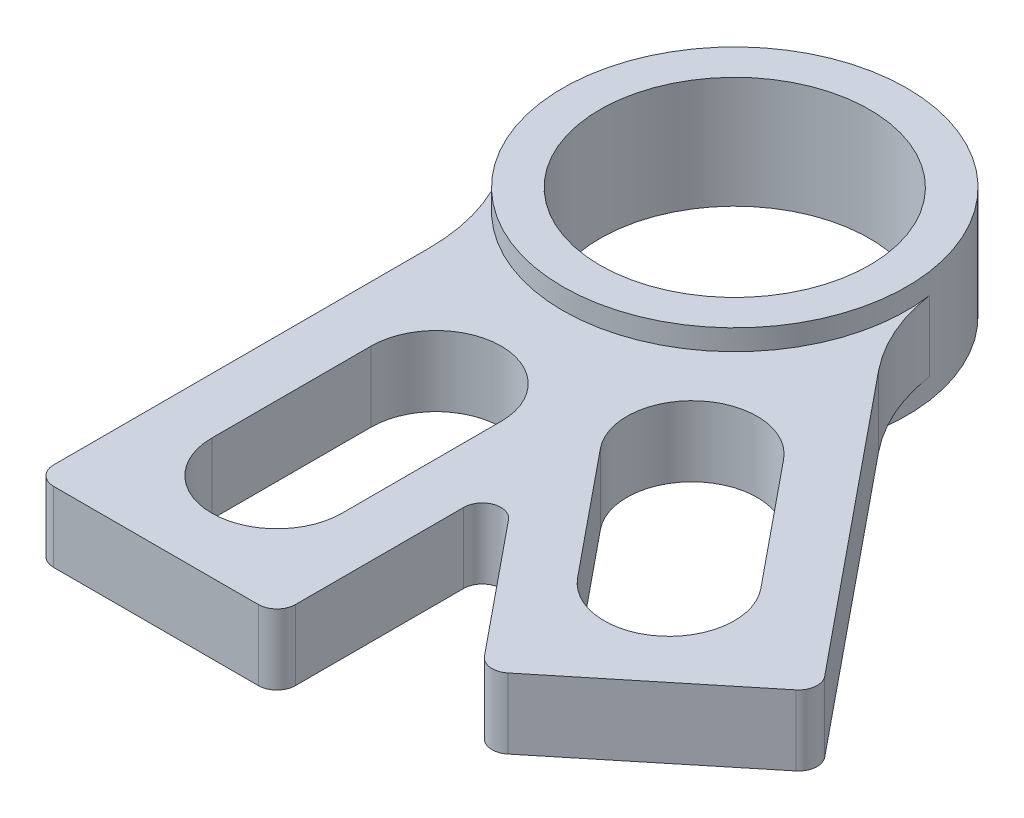
ISO-10303-21;
HEADER;
FILE_DESCRIPTION(('STEP AP214'),'2;1');
FILE_NAME('part.step','',(''),(''),'','','');
FILE_SCHEMA(('AUTOMOTIVE_DESIGN { 1 0 10303 214 1 1 1 1 }'));
ENDSEC;
DATA;
#1=APPLICATION_CONTEXT('core data for automotive mechanical design processes');
#2=APPLICATION_PROTOCOL_DEFINITION('international standard','automotive_design',2000,#1);
#3=PRODUCT_CONTEXT('',#1,'mechanical');
#4=PRODUCT('Part','Part','',(#3));
#5=PRODUCT_RELATED_PRODUCT_CATEGORY('part','',(#4));
#6=PRODUCT_DEFINITION_FORMATION('','',#4);
#7=PRODUCT_DEFINITION_CONTEXT('part definition',#1,'design');
#8=PRODUCT_DEFINITION('design','',#6,#7);
#9=PRODUCT_DEFINITION_SHAPE('','',#8);
#10=(LENGTH_UNIT() NAMED_UNIT(*) SI_UNIT(.MILLI.,.METRE.));
#11=(NAMED_UNIT(*) PLANE_ANGLE_UNIT() SI_UNIT($,.RADIAN.));
#12=(NAMED_UNIT(*) SI_UNIT($,.STERADIAN.) SOLID_ANGLE_UNIT());
#13=UNCERTAINTY_MEASURE_WITH_UNIT(LENGTH_MEASURE(1.E-05),#10,'distance_accuracy_value','');
#14=(GEOMETRIC_REPRESENTATION_CONTEXT(3) GLOBAL_UNCERTAINTY_ASSIGNED_CONTEXT((#13)) GLOBAL_UNIT_ASSIGNED_CONTEXT((#10,
#11,#12)) REPRESENTATION_CONTEXT('',''));
#15=CARTESIAN_POINT('',(0.,0.,0.));
#16=DIRECTION('',(0.,0.,1.));
#17=DIRECTION('',(1.,0.,0.));
#18=AXIS2_PLACEMENT_3D('',#15,#16,#17);
#19=CARTESIAN_POINT('',(0.,-4.7625,0.));
#20=DIRECTION('',(0.,1.,0.));
#21=DIRECTION('',(0.,0.,1.));
#22=AXIS2_PLACEMENT_3D('',#19,#20,#21);
#23=CYLINDRICAL_SURFACE('',#22,14.6812);
#24=CARTESIAN_POINT('',(0.,-4.7625,0.));
#25=DIRECTION('',(0.,1.,0.));
#26=DIRECTION('',(0.,0.,1.));
#27=AXIS2_PLACEMENT_3D('',#24,#25,#26);
#28=CIRCLE('',#27,14.6812);
#29=CARTESIAN_POINT('',(0.,-4.7625,14.6812));
#30=VERTEX_POINT('',#29);
#31=EDGE_CURVE('E355',#30,#30,#28,.T.);
#32=ORIENTED_EDGE('',*,*,#31,.T.);
#33=EDGE_LOOP('',(#32));
#34=FACE_BOUND('',#33,.T.);
#35=CARTESIAN_POINT('',(0.,4.7625,0.));
#36=DIRECTION('',(0.,1.,0.));
#37=DIRECTION('',(0.,0.,1.));
#38=AXIS2_PLACEMENT_3D('',#35,#36,#37);
#39=CIRCLE('',#38,14.6812);
#40=CARTESIAN_POINT('',(0.,4.7625,14.6812));
#41=VERTEX_POINT('',#40);
#42=EDGE_CURVE('E347',#41,#41,#39,.T.);
#43=ORIENTED_EDGE('',*,*,#42,.F.);
#44=EDGE_LOOP('',(#43));
#45=FACE_BOUND('',#44,.T.);
#46=DIRECTION('',(0.,1.,0.));
#47=VECTOR('',#46,1.);
#48=CARTESIAN_POINT('',(-12.5938687913907,-4.7625,7.54533646070436));
#49=LINE('',#48,#47);
#50=CARTESIAN_POINT('',(-12.5938687913907,-2.9972,7.54533646070437));
#51=VERTEX_POINT('',#50);
#52=CARTESIAN_POINT('',(-12.5938687913907,2.9972,7.54533646070437));
#53=VERTEX_POINT('',#52);
#54=EDGE_CURVE('E363',#51,#53,#49,.T.);
#55=ORIENTED_EDGE('',*,*,#54,.T.);
#56=CARTESIAN_POINT('',(0.,2.9972,0.));
#57=DIRECTION('',(0.,1.,0.));
#58=DIRECTION('',(0.,0.,1.));
#59=AXIS2_PLACEMENT_3D('',#56,#57,#58);
#60=CIRCLE('',#59,14.6812);
#61=CARTESIAN_POINT('',(14.5288172052398,2.9972,-2.10976398128508));
#62=VERTEX_POINT('',#61);
#63=EDGE_CURVE('E248',#53,#62,#60,.T.);
#64=ORIENTED_EDGE('',*,*,#63,.T.);
#65=DIRECTION('',(0.,1.,0.));
#66=VECTOR('',#65,1.);
#67=CARTESIAN_POINT('',(14.5288172052398,-4.7625,-2.10976398128508));
#68=LINE('',#67,#66);
#69=CARTESIAN_POINT('',(14.5288172052398,-2.9972,-2.10976398128508));
#70=VERTEX_POINT('',#69);
#71=EDGE_CURVE('E359',#62,#70,#68,.F.);
#72=ORIENTED_EDGE('',*,*,#71,.T.);
#73=CARTESIAN_POINT('',(0.,-2.9972,0.));
#74=DIRECTION('',(0.,1.,0.));
#75=DIRECTION('',(0.,0.,1.));
#76=AXIS2_PLACEMENT_3D('',#73,#74,#75);
#77=CIRCLE('',#76,14.6812);
#78=EDGE_CURVE('E300',#51,#70,#77,.T.);
#79=ORIENTED_EDGE('',*,*,#78,.F.);
#80=EDGE_LOOP('',(#55,#64,#72,#79));
#81=FACE_BOUND('',#80,.T.);
#82=ADVANCED_FACE('F47',(#34,#45,#81),#23,.T.);
#83=CARTESIAN_POINT('',(0.,-4.7625,0.));
#84=DIRECTION('',(0.,1.,0.));
#85=DIRECTION('',(0.,0.,1.));
#86=AXIS2_PLACEMENT_3D('',#83,#84,#85);
#87=CYLINDRICAL_SURFACE('',#86,11.5062);
#88=CARTESIAN_POINT('',(0.,-4.7625,0.));
#89=DIRECTION('',(0.,1.,0.));
#90=DIRECTION('',(0.,0.,1.));
#91=AXIS2_PLACEMENT_3D('',#88,#89,#90);
#92=CIRCLE('',#91,11.5062);
#93=CARTESIAN_POINT('',(0.,-4.7625,11.5062));
#94=VERTEX_POINT('',#93);
#95=EDGE_CURVE('E351',#94,#94,#92,.T.);
#96=CARTESIAN_POINT('',(0.,4.7625,0.));
#97=DIRECTION('',(0.,1.,0.));
#98=DIRECTION('',(0.,0.,1.));
#99=AXIS2_PLACEMENT_3D('',#96,#97,#98);
#100=CIRCLE('',#99,11.5062);
#101=CARTESIAN_POINT('',(0.,4.7625,11.5062));
#102=VERTEX_POINT('',#101);
#103=EDGE_CURVE('E326',#102,#102,#100,.T.);
#104=CARTESIAN_POINT('',(0.,-4.7625,11.5062));
#105=CARTESIAN_POINT('',(0.,-4.66328125,11.5062));
#106=CARTESIAN_POINT('',(0.,-4.5640625,11.5062));
#107=CARTESIAN_POINT('',(0.,-4.365625,11.5062));
#108=CARTESIAN_POINT('',(0.,-4.26640625,11.5062));
#109=CARTESIAN_POINT('',(0.,-4.06796875,11.5062));
#110=CARTESIAN_POINT('',(0.,-3.96875,11.5062));
#111=CARTESIAN_POINT('',(0.,-3.7703125,11.5062));
#112=CARTESIAN_POINT('',(0.,-3.67109375,11.5062));
#113=CARTESIAN_POINT('',(0.,-3.47265625,11.5062));
#114=CARTESIAN_POINT('',(0.,-3.3734375,11.5062));
#115=CARTESIAN_POINT('',(0.,-3.175,11.5062));
#116=CARTESIAN_POINT('',(0.,-3.07578125,11.5062));
#117=CARTESIAN_POINT('',(0.,-2.87734375,11.5062));
#118=CARTESIAN_POINT('',(0.,-2.778125,11.5062));
#119=CARTESIAN_POINT('',(0.,-2.5796875,11.5062));
#120=CARTESIAN_POINT('',(0.,-2.48046875,11.5062));
#121=CARTESIAN_POINT('',(0.,-2.28203125,11.5062));
#122=CARTESIAN_POINT('',(0.,-2.1828125,11.5062));
#123=CARTESIAN_POINT('',(0.,-1.984375,11.5062));
#124=CARTESIAN_POINT('',(0.,-1.88515625,11.5062));
#125=CARTESIAN_POINT('',(0.,-1.68671875,11.5062));
#126=CARTESIAN_POINT('',(0.,-1.5875,11.5062));
#127=CARTESIAN_POINT('',(0.,-1.3890625,11.5062));
#128=CARTESIAN_POINT('',(0.,-1.28984375,11.5062));
#129=CARTESIAN_POINT('',(0.,-1.09140625,11.5062));
#130=CARTESIAN_POINT('',(0.,-0.9921875,11.5062));
#131=CARTESIAN_POINT('',(0.,-0.79375,11.5062));
#132=CARTESIAN_POINT('',(0.,-0.69453125,11.5062));
#133=CARTESIAN_POINT('',(0.,-0.49609375,11.5062));
#134=CARTESIAN_POINT('',(0.,-0.396875,11.5062));
#135=CARTESIAN_POINT('',(0.,-0.1984375,11.5062));
#136=CARTESIAN_POINT('',(0.,-0.0992187500000001,11.5062));
#137=CARTESIAN_POINT('',(0.,0.0992187500000001,11.5062));
#138=CARTESIAN_POINT('',(0.,0.1984375,11.5062));
#139=CARTESIAN_POINT('',(0.,0.396875,11.5062));
#140=CARTESIAN_POINT('',(0.,0.49609375,11.5062));
#141=CARTESIAN_POINT('',(0.,0.69453125,11.5062));
#142=CARTESIAN_POINT('',(0.,0.793750000000001,11.5062));
#143=CARTESIAN_POINT('',(0.,0.992187500000001,11.5062));
#144=CARTESIAN_POINT('',(0.,1.09140625,11.5062));
#145=CARTESIAN_POINT('',(0.,1.28984375,11.5062));
#146=CARTESIAN_POINT('',(0.,1.3890625,11.5062));
#147=CARTESIAN_POINT('',(0.,1.5875,11.5062));
#148=CARTESIAN_POINT('',(0.,1.68671875,11.5062));
#149=CARTESIAN_POINT('',(0.,1.88515625,11.5062));
#150=CARTESIAN_POINT('',(0.,1.984375,11.5062));
#151=CARTESIAN_POINT('',(0.,2.1828125,11.5062));
#152=CARTESIAN_POINT('',(0.,2.28203125,11.5062));
#153=CARTESIAN_POINT('',(0.,2.48046875,11.5062));
#154=CARTESIAN_POINT('',(0.,2.5796875,11.5062));
#155=CARTESIAN_POINT('',(0.,2.778125,11.5062));
#156=CARTESIAN_POINT('',(0.,2.87734375,11.5062));
#157=CARTESIAN_POINT('',(0.,3.07578125,11.5062));
#158=CARTESIAN_POINT('',(0.,3.175,11.5062));
#159=CARTESIAN_POINT('',(0.,3.3734375,11.5062));
#160=CARTESIAN_POINT('',(0.,3.47265625,11.5062));
#161=CARTESIAN_POINT('',(0.,3.67109375,11.5062));
#162=CARTESIAN_POINT('',(0.,3.7703125,11.5062));
#163=CARTESIAN_POINT('',(0.,3.96875,11.5062));
#164=CARTESIAN_POINT('',(0.,4.06796875,11.5062));
#165=CARTESIAN_POINT('',(0.,4.26640625,11.5062));
#166=CARTESIAN_POINT('',(0.,4.365625,11.5062));
#167=CARTESIAN_POINT('',(0.,4.5640625,11.5062));
#168=CARTESIAN_POINT('',(0.,4.66328125,11.5062));
#169=CARTESIAN_POINT('',(0.,4.7625,11.5062));
#170=B_SPLINE_CURVE_WITH_KNOTS('',3,(#104,#105,#106,#107,#108,#109,#110,#111,#112,#113,#114,
#115,#116,#117,#118,#119,#120,#121,#122,#123,#124,#125,#126,#127,#128,#129,#130,#131,#132,#133,
#134,#135,#136,#137,#138,#139,#140,#141,#142,#143,#144,#145,#146,#147,#148,#149,#150,#151,#152,
#153,#154,#155,#156,#157,#158,#159,#160,#161,#162,#163,#164,#165,#166,#167,#168,#169),
.UNSPECIFIED.,.F.,.F.,(4,2,2,2,2,2,2,2,2,2,2,2,2,2,2,2,2,2,2,2,2,2,2,2,2,2,2,2,2,2,2,2,4),(0.,
0.297656249999999,0.595312499999999,0.89296875,1.190625,1.48828125,1.7859375,2.08359375,2.38125,
2.67890625,2.9765625,3.27421875,3.571875,3.86953125,4.1671875,4.46484375,4.7625,5.06015625,
5.3578125,5.65546875,5.953125,6.25078125,6.5484375,6.84609375,7.14375,7.44140625,7.7390625,
8.03671875,8.334375,8.63203125,8.9296875,9.22734375,9.525),.UNSPECIFIED.);
#171=EDGE_CURVE('BSEAM514',#94,#102,#170,.T.);
#172=ORIENTED_EDGE('',*,*,#95,.F.);
#173=ORIENTED_EDGE('',*,*,#103,.T.);
#174=ORIENTED_EDGE('',*,*,#171,.T.);
#175=ORIENTED_EDGE('',*,*,#171,.F.);
#176=EDGE_LOOP('',(#172,#174,#173,#175));
#177=FACE_BOUND('',#176,.T.);
#178=ADVANCED_FACE('F514',(#177),#87,.F.);
#179=CARTESIAN_POINT('',(0.,-4.7625,0.));
#180=DIRECTION('',(0.,1.,0.));
#181=DIRECTION('',(0.,0.,1.));
#182=AXIS2_PLACEMENT_3D('',#179,#180,#181);
#183=PLANE('',#182);
#184=ORIENTED_EDGE('',*,*,#95,.T.);
#185=EDGE_LOOP('',(#184));
#186=FACE_BOUND('',#185,.T.);
#187=ORIENTED_EDGE('',*,*,#31,.F.);
#188=EDGE_LOOP('',(#187));
#189=FACE_BOUND('',#188,.T.);
#190=ADVANCED_FACE('F522',(#186,#189),#183,.F.);
#191=CARTESIAN_POINT('',(0.,4.7625,0.));
#192=DIRECTION('',(0.,1.,0.));
#193=DIRECTION('',(0.,0.,1.));
#194=AXIS2_PLACEMENT_3D('',#191,#192,#193);
#195=PLANE('',#194);
#196=ORIENTED_EDGE('',*,*,#103,.F.);
#197=EDGE_LOOP('',(#196));
#198=FACE_BOUND('',#197,.T.);
#199=ORIENTED_EDGE('',*,*,#42,.T.);
#200=EDGE_LOOP('',(#199));
#201=FACE_BOUND('',#200,.T.);
#202=ADVANCED_FACE('F544',(#198,#201),#195,.T.);
#203=CARTESIAN_POINT('',(7.99767624212261,-2.9972,-6.52025891270336));
#204=DIRECTION('',(0.775062506807763,0.,-0.631884570583003));
#205=DIRECTION('',(-0.631884570583003,0.,-0.775062506807763));
#206=AXIS2_PLACEMENT_3D('',#203,#204,#205);
#207=PLANE('',#206);
#208=DIRECTION('',(-0.631884570583003,0.,-0.775062506807763));
#209=VECTOR('',#208,1.);
#210=CARTESIAN_POINT('',(7.99767624212261,2.9972,-6.52025891270336));
#211=LINE('',#210,#209);
#212=CARTESIAN_POINT('',(38.2035279927878,2.9972,30.5298990877268));
#213=VERTEX_POINT('',#212);
#214=CARTESIAN_POINT('',(17.9621749977744,2.9972,5.70208317979728));
#215=VERTEX_POINT('',#214);
#216=EDGE_CURVE('E270',#213,#215,#211,.T.);
#217=ORIENTED_EDGE('',*,*,#216,.F.);
#218=DIRECTION('',(0.,1.,0.));
#219=VECTOR('',#218,1.);
#220=CARTESIAN_POINT('',(38.2035279927878,-2.9972,30.5298990877268));
#221=LINE('',#220,#219);
#222=CARTESIAN_POINT('',(38.2035279927878,-2.9972,30.5298990877268));
#223=VERTEX_POINT('',#222);
#224=EDGE_CURVE('E410',#213,#223,#221,.F.);
#225=ORIENTED_EDGE('',*,*,#224,.T.);
#226=DIRECTION('',(-0.631884570583003,0.,-0.775062506807763));
#227=VECTOR('',#226,1.);
#228=CARTESIAN_POINT('',(7.99767624212261,-2.9972,-6.52025891270336));
#229=LINE('',#228,#227);
#230=CARTESIAN_POINT('',(17.9621749977744,-2.9972,5.70208317979728));
#231=VERTEX_POINT('',#230);
#232=EDGE_CURVE('E209',#223,#231,#229,.T.);
#233=ORIENTED_EDGE('',*,*,#232,.T.);
#234=DIRECTION('',(0.,-1.,0.));
#235=VECTOR('',#234,1.);
#236=CARTESIAN_POINT('',(17.9621749977744,2.9972,5.70208317979728));
#237=LINE('',#236,#235);
#238=EDGE_CURVE('E371',#231,#215,#237,.F.);
#239=ORIENTED_EDGE('',*,*,#238,.T.);
#240=EDGE_LOOP('',(#217,#225,#233,#239));
#241=FACE_BOUND('',#240,.T.);
#242=ADVANCED_FACE('F540',(#241),#207,.T.);
#243=CARTESIAN_POINT('',(31.2089685064657,-2.9972,38.2805697299875));
#244=DIRECTION('',(0.631884570583003,0.,0.775062506807763));
#245=DIRECTION('',(0.775062506807763,0.,-0.631884570583003));
#246=AXIS2_PLACEMENT_3D('',#243,#244,#245);
#247=PLANE('',#246);
#248=DIRECTION('',(0.775062506807763,0.,-0.631884570583003));
#249=VECTOR('',#248,1.);
#250=CARTESIAN_POINT('',(31.2089685064657,-2.9972,38.2805697299875));
#251=LINE('',#250,#249);
#252=CARTESIAN_POINT('',(24.4417039939004,-2.9972,43.7977118868903));
#253=VERTEX_POINT('',#252);
#254=CARTESIAN_POINT('',(37.976233019031,-2.9972,32.7634275730846));
#255=VERTEX_POINT('',#254);
#256=EDGE_CURVE('E317',#253,#255,#251,.T.);
#257=ORIENTED_EDGE('',*,*,#256,.T.);
#258=DIRECTION('',(0.,1.,0.));
#259=VECTOR('',#258,1.);
#260=CARTESIAN_POINT('',(37.976233019031,-2.9972,32.7634275730846));
#261=LINE('',#260,#259);
#262=CARTESIAN_POINT('',(37.976233019031,2.9972,32.7634275730846));
#263=VERTEX_POINT('',#262);
#264=EDGE_CURVE('E394',#255,#263,#261,.T.);
#265=ORIENTED_EDGE('',*,*,#264,.T.);
#266=DIRECTION('',(0.775062506807763,0.,-0.631884570583003));
#267=VECTOR('',#266,1.);
#268=CARTESIAN_POINT('',(31.2089685064657,2.9972,38.2805697299875));
#269=LINE('',#268,#267);
#270=CARTESIAN_POINT('',(24.4417039939004,2.9972,43.7977118868903));
#271=VERTEX_POINT('',#270);
#272=EDGE_CURVE('E266',#271,#263,#269,.T.);
#273=ORIENTED_EDGE('',*,*,#272,.F.);
#274=DIRECTION('',(0.,1.,0.));
#275=VECTOR('',#274,1.);
#276=CARTESIAN_POINT('',(24.4417039939004,-2.9972,43.7977118868903));
#277=LINE('',#276,#275);
#278=EDGE_CURVE('E391',#271,#253,#277,.F.);
#279=ORIENTED_EDGE('',*,*,#278,.T.);
#280=EDGE_LOOP('',(#257,#265,#273,#279));
#281=FACE_BOUND('',#280,.T.);
#282=ADVANCED_FACE('F499',(#281),#247,.T.);
#283=CARTESIAN_POINT('',(-7.9976762421226,-2.9972,6.52025891270336));
#284=DIRECTION('',(-0.775062506807763,0.,0.631884570583003));
#285=DIRECTION('',(0.631884570583003,0.,0.775062506807763));
#286=AXIS2_PLACEMENT_3D('',#283,#284,#285);
#287=PLANE('',#286);
#288=DIRECTION('',(0.631884570583003,0.,0.775062506807763));
#289=VECTOR('',#288,1.);
#290=CARTESIAN_POINT('',(-7.9976762421226,-2.9972,6.52025891270336));
#291=LINE('',#290,#289);
#292=CARTESIAN_POINT('',(13.1366617295573,-2.9972,32.4434001486723));
#293=VERTEX_POINT('',#292);
#294=CARTESIAN_POINT('',(22.2081755085426,-2.9972,43.5704169131335));
#295=VERTEX_POINT('',#294);
#296=EDGE_CURVE('E313',#293,#295,#291,.T.);
#297=ORIENTED_EDGE('',*,*,#296,.T.);
#298=DIRECTION('',(0.,1.,0.));
#299=VECTOR('',#298,1.);
#300=CARTESIAN_POINT('',(22.2081755085426,-2.9972,43.5704169131335));
#301=LINE('',#300,#299);
#302=CARTESIAN_POINT('',(22.2081755085426,2.9972,43.5704169131335));
#303=VERTEX_POINT('',#302);
#304=EDGE_CURVE('E426',#295,#303,#301,.T.);
#305=ORIENTED_EDGE('',*,*,#304,.T.);
#306=DIRECTION('',(0.631884570583003,0.,0.775062506807763));
#307=VECTOR('',#306,1.);
#308=CARTESIAN_POINT('',(-7.9976762421226,2.9972,6.52025891270336));
#309=LINE('',#308,#307);
#310=CARTESIAN_POINT('',(13.1366617295573,2.9972,32.4434001486723));
#311=VERTEX_POINT('',#310);
#312=EDGE_CURVE('E262',#311,#303,#309,.T.);
#313=ORIENTED_EDGE('',*,*,#312,.F.);
#314=DIRECTION('',(0.,1.,0.));
#315=VECTOR('',#314,1.);
#316=CARTESIAN_POINT('',(13.1366617295573,-2.9972,32.4434001486723));
#317=LINE('',#316,#315);
#318=EDGE_CURVE('E423',#311,#293,#317,.F.);
#319=ORIENTED_EDGE('',*,*,#318,.T.);
#320=EDGE_LOOP('',(#297,#305,#313,#319));
#321=FACE_BOUND('',#320,.T.);
#322=ADVANCED_FACE('F455',(#321),#287,.T.);
#323=CARTESIAN_POINT('',(10.31875,-2.9972,0.));
#324=DIRECTION('',(1.,0.,0.));
#325=DIRECTION('',(0.,0.,-1.));
#326=AXIS2_PLACEMENT_3D('',#323,#324,#325);
#327=PLANE('',#326);
#328=DIRECTION('',(0.,0.,-1.));
#329=VECTOR('',#328,1.);
#330=CARTESIAN_POINT('',(10.31875,-2.9972,0.));
#331=LINE('',#330,#329);
#332=CARTESIAN_POINT('',(10.31875,-2.9972,47.8028));
#333=VERTEX_POINT('',#332);
#334=CARTESIAN_POINT('',(10.31875,-2.9972,33.4465169044728));
#335=VERTEX_POINT('',#334);
#336=EDGE_CURVE('E309',#333,#335,#331,.T.);
#337=ORIENTED_EDGE('',*,*,#336,.T.);
#338=DIRECTION('',(0.,1.,0.));
#339=VECTOR('',#338,1.);
#340=CARTESIAN_POINT('',(10.31875,2.9972,33.4465169044728));
#341=LINE('',#340,#339);
#342=CARTESIAN_POINT('',(10.31875,2.9972,33.4465169044728));
#343=VERTEX_POINT('',#342);
#344=EDGE_CURVE('E433',#335,#343,#341,.T.);
#345=ORIENTED_EDGE('',*,*,#344,.T.);
#346=DIRECTION('',(0.,0.,-1.));
#347=VECTOR('',#346,1.);
#348=CARTESIAN_POINT('',(10.31875,2.9972,0.));
#349=LINE('',#348,#347);
#350=CARTESIAN_POINT('',(10.31875,2.9972,47.8028));
#351=VERTEX_POINT('',#350);
#352=EDGE_CURVE('E258',#351,#343,#349,.T.);
#353=ORIENTED_EDGE('',*,*,#352,.F.);
#354=DIRECTION('',(0.,1.,0.));
#355=VECTOR('',#354,1.);
#356=CARTESIAN_POINT('',(10.31875,-2.9972,47.8028));
#357=LINE('',#356,#355);
#358=EDGE_CURVE('E430',#351,#333,#357,.F.);
#359=ORIENTED_EDGE('',*,*,#358,.T.);
#360=EDGE_LOOP('',(#337,#345,#353,#359));
#361=FACE_BOUND('',#360,.T.);
#362=ADVANCED_FACE('F463',(#361),#327,.T.);
#363=CARTESIAN_POINT('',(0.,-2.9972,49.3903));
#364=DIRECTION('',(0.,0.,1.));
#365=DIRECTION('',(1.,0.,0.));
#366=AXIS2_PLACEMENT_3D('',#363,#364,#365);
#367=PLANE('',#366);
#368=DIRECTION('',(1.,0.,0.));
#369=VECTOR('',#368,1.);
#370=CARTESIAN_POINT('',(0.,-2.9972,49.3903));
#371=LINE('',#370,#369);
#372=CARTESIAN_POINT('',(-8.73125,-2.9972,49.3903));
#373=VERTEX_POINT('',#372);
#374=CARTESIAN_POINT('',(8.73125,-2.9972,49.3903));
#375=VERTEX_POINT('',#374);
#376=EDGE_CURVE('E306',#373,#375,#371,.T.);
#377=ORIENTED_EDGE('',*,*,#376,.T.);
#378=DIRECTION('',(0.,1.,0.));
#379=VECTOR('',#378,1.);
#380=CARTESIAN_POINT('',(8.73125,-2.9972,49.3903));
#381=LINE('',#380,#379);
#382=CARTESIAN_POINT('',(8.73125,2.9972,49.3903));
#383=VERTEX_POINT('',#382);
#384=EDGE_CURVE('E440',#375,#383,#381,.T.);
#385=ORIENTED_EDGE('',*,*,#384,.T.);
#386=DIRECTION('',(1.,0.,0.));
#387=VECTOR('',#386,1.);
#388=CARTESIAN_POINT('',(0.,2.9972,49.3903));
#389=LINE('',#388,#387);
#390=CARTESIAN_POINT('',(-8.73125,2.9972,49.3903));
#391=VERTEX_POINT('',#390);
#392=EDGE_CURVE('E254',#391,#383,#389,.T.);
#393=ORIENTED_EDGE('',*,*,#392,.F.);
#394=DIRECTION('',(0.,1.,0.));
#395=VECTOR('',#394,1.);
#396=CARTESIAN_POINT('',(-8.73125,-2.9972,49.3903));
#397=LINE('',#396,#395);
#398=EDGE_CURVE('E437',#391,#373,#397,.F.);
#399=ORIENTED_EDGE('',*,*,#398,.T.);
#400=EDGE_LOOP('',(#377,#385,#393,#399));
#401=FACE_BOUND('',#400,.T.);
#402=ADVANCED_FACE('F470',(#401),#367,.T.);
#403=CARTESIAN_POINT('',(0.,-2.9972,39.07155));
#404=DIRECTION('',(0.,1.,0.));
#405=DIRECTION('',(0.,0.,1.));
#406=AXIS2_PLACEMENT_3D('',#403,#404,#405);
#407=CYLINDRICAL_SURFACE('',#406,5.55625);
#408=DIRECTION('',(0.,1.,0.));
#409=VECTOR('',#408,1.);
#410=CARTESIAN_POINT('',(-5.55625,-2.9972,39.07155));
#411=LINE('',#410,#409);
#412=CARTESIAN_POINT('',(-5.55625,-2.9972,39.07155));
#413=VERTEX_POINT('',#412);
#414=CARTESIAN_POINT('',(-5.55625,2.9972,39.07155));
#415=VERTEX_POINT('',#414);
#416=EDGE_CURVE('E333',#413,#415,#411,.T.);
#417=ORIENTED_EDGE('',*,*,#416,.T.);
#418=CARTESIAN_POINT('',(0.,2.9972,39.07155));
#419=DIRECTION('',(0.,1.,0.));
#420=DIRECTION('',(0.,0.,1.));
#421=AXIS2_PLACEMENT_3D('',#418,#419,#420);
#422=CIRCLE('',#421,5.55625);
#423=CARTESIAN_POINT('',(5.55625,2.9972,39.07155));
#424=VERTEX_POINT('',#423);
#425=EDGE_CURVE('E232',#415,#424,#422,.T.);
#426=ORIENTED_EDGE('',*,*,#425,.T.);
#427=DIRECTION('',(0.,1.,0.));
#428=VECTOR('',#427,1.);
#429=CARTESIAN_POINT('',(5.55625,-2.9972,39.07155));
#430=LINE('',#429,#428);
#431=CARTESIAN_POINT('',(5.55625,-2.9972,39.07155));
#432=VERTEX_POINT('',#431);
#433=EDGE_CURVE('E323',#432,#424,#430,.T.);
#434=ORIENTED_EDGE('',*,*,#433,.F.);
#435=CARTESIAN_POINT('',(0.,-2.9972,39.07155));
#436=DIRECTION('',(0.,1.,0.));
#437=DIRECTION('',(0.,0.,1.));
#438=AXIS2_PLACEMENT_3D('',#435,#436,#437);
#439=CIRCLE('',#438,5.55625);
#440=EDGE_CURVE('E286',#413,#432,#439,.T.);
#441=ORIENTED_EDGE('',*,*,#440,.F.);
#442=EDGE_LOOP('',(#417,#426,#434,#441));
#443=FACE_BOUND('',#442,.T.);
#444=ADVANCED_FACE('F574',(#443),#407,.F.);
#445=CARTESIAN_POINT('',(5.55625000000002,-2.9972,0.));
#446=DIRECTION('',(-1.,0.,0.));
#447=DIRECTION('',(0.,0.,1.));
#448=AXIS2_PLACEMENT_3D('',#445,#446,#447);
#449=PLANE('',#448);
#450=ORIENTED_EDGE('',*,*,#433,.T.);
#451=DIRECTION('',(0.,0.,1.));
#452=VECTOR('',#451,1.);
#453=CARTESIAN_POINT('',(5.55625000000002,2.9972,0.));
#454=LINE('',#453,#452);
#455=CARTESIAN_POINT('',(5.55625,2.9972,25.48255));
#456=VERTEX_POINT('',#455);
#457=EDGE_CURVE('E244',#456,#424,#454,.T.);
#458=ORIENTED_EDGE('',*,*,#457,.F.);
#459=DIRECTION('',(0.,1.,0.));
#460=VECTOR('',#459,1.);
#461=CARTESIAN_POINT('',(5.55625,-2.9972,25.48255));
#462=LINE('',#461,#460);
#463=CARTESIAN_POINT('',(5.55625,-2.9972,25.48255));
#464=VERTEX_POINT('',#463);
#465=EDGE_CURVE('E327',#464,#456,#462,.T.);
#466=ORIENTED_EDGE('',*,*,#465,.F.);
#467=DIRECTION('',(0.,0.,1.));
#468=VECTOR('',#467,1.);
#469=CARTESIAN_POINT('',(5.55625000000002,-2.9972,0.));
#470=LINE('',#469,#468);
#471=EDGE_CURVE('E296',#464,#432,#470,.T.);
#472=ORIENTED_EDGE('',*,*,#471,.T.);
#473=EDGE_LOOP('',(#450,#458,#466,#472));
#474=FACE_BOUND('',#473,.T.);
#475=ADVANCED_FACE('F684',(#474),#449,.T.);
#476=CARTESIAN_POINT('',(0.,-2.9972,25.48255));
#477=DIRECTION('',(0.,1.,0.));
#478=DIRECTION('',(0.,0.,1.));
#479=AXIS2_PLACEMENT_3D('',#476,#477,#478);
#480=CYLINDRICAL_SURFACE('',#479,5.55625);
#481=ORIENTED_EDGE('',*,*,#465,.T.);
#482=CARTESIAN_POINT('',(0.,2.9972,25.48255));
#483=DIRECTION('',(0.,1.,0.));
#484=DIRECTION('',(0.,0.,1.));
#485=AXIS2_PLACEMENT_3D('',#482,#483,#484);
#486=CIRCLE('',#485,5.55625);
#487=CARTESIAN_POINT('',(-5.55625,2.9972,25.48255));
#488=VERTEX_POINT('',#487);
#489=EDGE_CURVE('E240',#488,#456,#486,.F.);
#490=ORIENTED_EDGE('',*,*,#489,.F.);
#491=DIRECTION('',(0.,1.,0.));
#492=VECTOR('',#491,1.);
#493=CARTESIAN_POINT('',(-5.55625,-2.9972,25.48255));
#494=LINE('',#493,#492);
#495=CARTESIAN_POINT('',(-5.55625,-2.9972,25.48255));
#496=VERTEX_POINT('',#495);
#497=EDGE_CURVE('E330',#496,#488,#494,.T.);
#498=ORIENTED_EDGE('',*,*,#497,.F.);
#499=CARTESIAN_POINT('',(0.,-2.9972,25.48255));
#500=DIRECTION('',(0.,1.,0.));
#501=DIRECTION('',(0.,0.,1.));
#502=AXIS2_PLACEMENT_3D('',#499,#500,#501);
#503=CIRCLE('',#502,5.55625);
#504=EDGE_CURVE('E292',#496,#464,#503,.F.);
#505=ORIENTED_EDGE('',*,*,#504,.T.);
#506=EDGE_LOOP('',(#481,#490,#498,#505));
#507=FACE_BOUND('',#506,.T.);
#508=ADVANCED_FACE('F676',(#507),#480,.F.);
#509=CARTESIAN_POINT('',(24.6887095937623,-2.9972,30.2828934878649));
#510=DIRECTION('',(0.,1.,0.));
#511=DIRECTION('',(0.,0.,1.));
#512=AXIS2_PLACEMENT_3D('',#509,#510,#511);
#513=CYLINDRICAL_SURFACE('',#512,5.55625000000002);
#514=DIRECTION('',(0.,1.,0.));
#515=VECTOR('',#514,1.);
#516=CARTESIAN_POINT('',(20.3822685403117,-2.9972,33.7938021331667));
#517=LINE('',#516,#515);
#518=CARTESIAN_POINT('',(20.3822685403117,-2.9972,33.7938021331667));
#519=VERTEX_POINT('',#518);
#520=CARTESIAN_POINT('',(20.3822685403117,2.9972,33.7938021331667));
#521=VERTEX_POINT('',#520);
#522=EDGE_CURVE('E198',#519,#521,#517,.T.);
#523=ORIENTED_EDGE('',*,*,#522,.T.);
#524=CARTESIAN_POINT('',(24.6887095937623,2.9972,30.2828934878649));
#525=DIRECTION('',(0.,1.,0.));
#526=DIRECTION('',(0.,0.,1.));
#527=AXIS2_PLACEMENT_3D('',#524,#525,#526);
#528=CIRCLE('',#527,5.55625000000002);
#529=CARTESIAN_POINT('',(28.995150647213,2.9972,26.771984842563));
#530=VERTEX_POINT('',#529);
#531=EDGE_CURVE('E202',#521,#530,#528,.T.);
#532=ORIENTED_EDGE('',*,*,#531,.T.);
#533=DIRECTION('',(0.,1.,0.));
#534=VECTOR('',#533,1.);
#535=CARTESIAN_POINT('',(28.995150647213,-2.9972,26.771984842563));
#536=LINE('',#535,#534);
#537=CARTESIAN_POINT('',(28.995150647213,-2.9972,26.771984842563));
#538=VERTEX_POINT('',#537);
#539=EDGE_CURVE('E336',#538,#530,#536,.T.);
#540=ORIENTED_EDGE('',*,*,#539,.F.);
#541=CARTESIAN_POINT('',(24.6887095937623,-2.9972,30.2828934878649));
#542=DIRECTION('',(0.,1.,0.));
#543=DIRECTION('',(0.,0.,1.));
#544=AXIS2_PLACEMENT_3D('',#541,#542,#543);
#545=CIRCLE('',#544,5.55625000000002);
#546=EDGE_CURVE('E203',#519,#538,#545,.T.);
#547=ORIENTED_EDGE('',*,*,#546,.F.);
#548=EDGE_LOOP('',(#523,#532,#540,#547));
#549=FACE_BOUND('',#548,.T.);
#550=ADVANCED_FACE('F200',(#549),#513,.F.);
#551=CARTESIAN_POINT('',(4.30644105345061,-2.9972,-3.5109086453018));
#552=DIRECTION('',(-0.775062506807762,0.,0.631884570583004));
#553=DIRECTION('',(0.631884570583004,0.,0.775062506807762));
#554=AXIS2_PLACEMENT_3D('',#551,#552,#553);
#555=PLANE('',#554);
#556=ORIENTED_EDGE('',*,*,#539,.T.);
#557=DIRECTION('',(0.631884570583004,0.,0.775062506807762));
#558=VECTOR('',#557,1.);
#559=CARTESIAN_POINT('',(4.30644105345061,2.9972,-3.5109086453018));
#560=LINE('',#559,#558);
#561=CARTESIAN_POINT('',(20.4084712175605,2.9972,16.2396604375524));
#562=VERTEX_POINT('',#561);
#563=EDGE_CURVE('E219',#562,#530,#560,.T.);
#564=ORIENTED_EDGE('',*,*,#563,.F.);
#565=DIRECTION('',(0.,1.,0.));
#566=VECTOR('',#565,1.);
#567=CARTESIAN_POINT('',(20.4084712175605,-2.9972,16.2396604375524));
#568=LINE('',#567,#566);
#569=CARTESIAN_POINT('',(20.4084712175605,-2.9972,16.2396604375524));
#570=VERTEX_POINT('',#569);
#571=EDGE_CURVE('E339',#570,#562,#568,.T.);
#572=ORIENTED_EDGE('',*,*,#571,.F.);
#573=DIRECTION('',(0.631884570583004,0.,0.775062506807762));
#574=VECTOR('',#573,1.);
#575=CARTESIAN_POINT('',(4.30644105345061,-2.9972,-3.5109086453018));
#576=LINE('',#575,#574);
#577=EDGE_CURVE('E282',#570,#538,#576,.T.);
#578=ORIENTED_EDGE('',*,*,#577,.T.);
#579=EDGE_LOOP('',(#556,#564,#572,#578));
#580=FACE_BOUND('',#579,.T.);
#581=ADVANCED_FACE('F659',(#580),#555,.T.);
#582=CARTESIAN_POINT('',(16.1020301641099,-2.9972,19.7505690828542));
#583=DIRECTION('',(0.,1.,0.));
#584=DIRECTION('',(0.,0.,1.));
#585=AXIS2_PLACEMENT_3D('',#582,#583,#584);
#586=CYLINDRICAL_SURFACE('',#585,5.55625);
#587=ORIENTED_EDGE('',*,*,#571,.T.);
#588=CARTESIAN_POINT('',(16.1020301641099,2.9972,19.7505690828542));
#589=DIRECTION('',(0.,1.,0.));
#590=DIRECTION('',(0.,0.,1.));
#591=AXIS2_PLACEMENT_3D('',#588,#589,#590);
#592=CIRCLE('',#591,5.55625);
#593=CARTESIAN_POINT('',(11.7955891106593,2.9972,23.261477728156));
#594=VERTEX_POINT('',#593);
#595=EDGE_CURVE('E225',#594,#562,#592,.F.);
#596=ORIENTED_EDGE('',*,*,#595,.F.);
#597=DIRECTION('',(0.,1.,0.));
#598=VECTOR('',#597,1.);
#599=CARTESIAN_POINT('',(11.7955891106593,-2.9972,23.261477728156));
#600=LINE('',#599,#598);
#601=CARTESIAN_POINT('',(11.7955891106593,-2.9972,23.261477728156));
#602=VERTEX_POINT('',#601);
#603=EDGE_CURVE('E208',#602,#594,#600,.T.);
#604=ORIENTED_EDGE('',*,*,#603,.F.);
#605=CARTESIAN_POINT('',(16.1020301641099,-2.9972,19.7505690828542));
#606=DIRECTION('',(0.,1.,0.));
#607=DIRECTION('',(0.,0.,1.));
#608=AXIS2_PLACEMENT_3D('',#605,#606,#607);
#609=CIRCLE('',#608,5.55625);
#610=EDGE_CURVE('E278',#602,#570,#609,.F.);
#611=ORIENTED_EDGE('',*,*,#610,.T.);
#612=EDGE_LOOP('',(#587,#596,#604,#611));
#613=FACE_BOUND('',#612,.T.);
#614=ADVANCED_FACE('F650',(#613),#586,.F.);
#615=CARTESIAN_POINT('',(-5.55625,-2.9972,0.));
#616=DIRECTION('',(-1.,0.,0.));
#617=DIRECTION('',(0.,0.,1.));
#618=AXIS2_PLACEMENT_3D('',#615,#616,#617);
#619=PLANE('',#618);
#620=ORIENTED_EDGE('',*,*,#497,.T.);
#621=DIRECTION('',(0.,0.,1.));
#622=VECTOR('',#621,1.);
#623=CARTESIAN_POINT('',(-5.55625,2.9972,0.));
#624=LINE('',#623,#622);
#625=EDGE_CURVE('E236',#488,#415,#624,.T.);
#626=ORIENTED_EDGE('',*,*,#625,.T.);
#627=ORIENTED_EDGE('',*,*,#416,.F.);
#628=DIRECTION('',(0.,0.,1.));
#629=VECTOR('',#628,1.);
#630=CARTESIAN_POINT('',(-5.55625,-2.9972,0.));
#631=LINE('',#630,#629);
#632=EDGE_CURVE('E289',#496,#413,#631,.T.);
#633=ORIENTED_EDGE('',*,*,#632,.F.);
#634=EDGE_LOOP('',(#620,#626,#627,#633));
#635=FACE_BOUND('',#634,.T.);
#636=ADVANCED_FACE('F642',(#635),#619,.F.);
#637=CARTESIAN_POINT('',(-4.30644105345062,-2.9972,3.5109086453018));
#638=DIRECTION('',(-0.775062506807764,0.,0.631884570583003));
#639=DIRECTION('',(0.631884570583003,0.,0.775062506807764));
#640=AXIS2_PLACEMENT_3D('',#637,#638,#639);
#641=PLANE('',#640);
#642=ORIENTED_EDGE('',*,*,#603,.T.);
#643=DIRECTION('',(0.631884570583003,0.,0.775062506807764));
#644=VECTOR('',#643,1.);
#645=CARTESIAN_POINT('',(-4.30644105345062,2.9972,3.5109086453018));
#646=LINE('',#645,#644);
#647=EDGE_CURVE('E217',#594,#521,#646,.T.);
#648=ORIENTED_EDGE('',*,*,#647,.T.);
#649=ORIENTED_EDGE('',*,*,#522,.F.);
#650=DIRECTION('',(0.631884570583003,0.,0.775062506807764));
#651=VECTOR('',#650,1.);
#652=CARTESIAN_POINT('',(-4.30644105345062,-2.9972,3.5109086453018));
#653=LINE('',#652,#651);
#654=EDGE_CURVE('E275',#602,#519,#653,.T.);
#655=ORIENTED_EDGE('',*,*,#654,.F.);
#656=EDGE_LOOP('',(#642,#648,#649,#655));
#657=FACE_BOUND('',#656,.T.);
#658=ADVANCED_FACE('F222',(#657),#641,.F.);
#659=CARTESIAN_POINT('',(-10.31875,-2.9972,0.));
#660=DIRECTION('',(1.,0.,0.));
#661=DIRECTION('',(0.,0.,-1.));
#662=AXIS2_PLACEMENT_3D('',#659,#660,#661);
#663=PLANE('',#662);
#664=DIRECTION('',(0.,0.,-1.));
#665=VECTOR('',#664,1.);
#666=CARTESIAN_POINT('',(-10.31875,-2.9972,0.));
#667=LINE('',#666,#665);
#668=CARTESIAN_POINT('',(-10.31875,-2.9972,47.8028));
#669=VERTEX_POINT('',#668);
#670=CARTESIAN_POINT('',(-10.31875,-2.9972,15.7694921185655));
#671=VERTEX_POINT('',#670);
#672=EDGE_CURVE('E303',#669,#671,#667,.T.);
#673=ORIENTED_EDGE('',*,*,#672,.F.);
#674=DIRECTION('',(0.,1.,0.));
#675=VECTOR('',#674,1.);
#676=CARTESIAN_POINT('',(-10.31875,2.9972,47.8028));
#677=LINE('',#676,#675);
#678=CARTESIAN_POINT('',(-10.31875,2.9972,47.8028));
#679=VERTEX_POINT('',#678);
#680=EDGE_CURVE('E444',#669,#679,#677,.T.);
#681=ORIENTED_EDGE('',*,*,#680,.T.);
#682=DIRECTION('',(0.,0.,-1.));
#683=VECTOR('',#682,1.);
#684=CARTESIAN_POINT('',(-10.31875,2.9972,0.));
#685=LINE('',#684,#683);
#686=CARTESIAN_POINT('',(-10.31875,2.9972,15.7694921185655));
#687=VERTEX_POINT('',#686);
#688=EDGE_CURVE('E251',#679,#687,#685,.T.);
#689=ORIENTED_EDGE('',*,*,#688,.T.);
#690=DIRECTION('',(0.,1.,0.));
#691=VECTOR('',#690,1.);
#692=CARTESIAN_POINT('',(-10.31875,-2.9972,15.7694921185655));
#693=LINE('',#692,#691);
#694=EDGE_CURVE('E367',#687,#671,#693,.F.);
#695=ORIENTED_EDGE('',*,*,#694,.T.);
#696=EDGE_LOOP('',(#673,#681,#689,#695));
#697=FACE_BOUND('',#696,.T.);
#698=ADVANCED_FACE('F476',(#697),#663,.F.);
#699=CARTESIAN_POINT('',(0.,-2.9972,0.));
#700=DIRECTION('',(0.,1.,0.));
#701=DIRECTION('',(0.,0.,1.));
#702=AXIS2_PLACEMENT_3D('',#699,#700,#701);
#703=PLANE('',#702);
#704=ORIENTED_EDGE('',*,*,#546,.T.);
#705=ORIENTED_EDGE('',*,*,#577,.F.);
#706=ORIENTED_EDGE('',*,*,#610,.F.);
#707=ORIENTED_EDGE('',*,*,#654,.T.);
#708=EDGE_LOOP('',(#704,#705,#706,#707));
#709=FACE_BOUND('',#708,.T.);
#710=ORIENTED_EDGE('',*,*,#440,.T.);
#711=ORIENTED_EDGE('',*,*,#471,.F.);
#712=ORIENTED_EDGE('',*,*,#504,.F.);
#713=ORIENTED_EDGE('',*,*,#632,.T.);
#714=EDGE_LOOP('',(#710,#711,#712,#713));
#715=FACE_BOUND('',#714,.T.);
#716=ORIENTED_EDGE('',*,*,#232,.F.);
#717=CARTESIAN_POINT('',(36.9731162632305,-2.9972,31.5330158435273));
#718=DIRECTION('',(0.,1.,0.));
#719=DIRECTION('',(0.,0.,1.));
#720=AXIS2_PLACEMENT_3D('',#717,#718,#719);
#721=CIRCLE('',#720,1.5875);
#722=EDGE_CURVE('E420',#223,#255,#721,.F.);
#723=ORIENTED_EDGE('',*,*,#722,.T.);
#724=ORIENTED_EDGE('',*,*,#256,.F.);
#725=CARTESIAN_POINT('',(23.4385872380999,-2.9972,42.567300157333));
#726=DIRECTION('',(0.,1.,0.));
#727=DIRECTION('',(0.,0.,1.));
#728=AXIS2_PLACEMENT_3D('',#725,#726,#727);
#729=CIRCLE('',#728,1.5875);
#730=EDGE_CURVE('E417',#253,#295,#729,.F.);
#731=ORIENTED_EDGE('',*,*,#730,.T.);
#732=ORIENTED_EDGE('',*,*,#296,.F.);
#733=CARTESIAN_POINT('',(11.90625,-2.9972,33.4465169044728));
#734=DIRECTION('',(0.,1.,0.));
#735=DIRECTION('',(0.,0.,1.));
#736=AXIS2_PLACEMENT_3D('',#733,#734,#735);
#737=CIRCLE('',#736,1.5875);
#738=EDGE_CURVE('E11',#293,#335,#737,.T.);
#739=ORIENTED_EDGE('',*,*,#738,.T.);
#740=ORIENTED_EDGE('',*,*,#336,.F.);
#741=CARTESIAN_POINT('',(8.73125,-2.9972,47.8028));
#742=DIRECTION('',(0.,1.,0.));
#743=DIRECTION('',(0.,0.,1.));
#744=AXIS2_PLACEMENT_3D('',#741,#742,#743);
#745=CIRCLE('',#744,1.5875);
#746=EDGE_CURVE('E69',#333,#375,#745,.F.);
#747=ORIENTED_EDGE('',*,*,#746,.T.);
#748=ORIENTED_EDGE('',*,*,#376,.F.);
#749=CARTESIAN_POINT('',(-8.73125,-2.9972,47.8028));
#750=DIRECTION('',(0.,1.,0.));
#751=DIRECTION('',(0.,0.,1.));
#752=AXIS2_PLACEMENT_3D('',#749,#750,#751);
#753=CIRCLE('',#752,1.5875);
#754=EDGE_CURVE('E63',#373,#669,#753,.F.);
#755=ORIENTED_EDGE('',*,*,#754,.T.);
#756=ORIENTED_EDGE('',*,*,#672,.T.);
#757=CARTESIAN_POINT('',(-26.32075,-2.9972,15.7694921185655));
#758=DIRECTION('',(0.,1.,0.));
#759=DIRECTION('',(0.,0.,1.));
#760=AXIS2_PLACEMENT_3D('',#757,#758,#759);
#761=CIRCLE('',#760,16.002);
#762=EDGE_CURVE('E379',#671,#51,#761,.T.);
#763=ORIENTED_EDGE('',*,*,#762,.T.);
#764=ORIENTED_EDGE('',*,*,#78,.T.);
#765=CARTESIAN_POINT('',(30.3647252317122,-2.9972,-4.40933371867194));
#766=DIRECTION('',(0.,1.,0.));
#767=DIRECTION('',(0.,0.,1.));
#768=AXIS2_PLACEMENT_3D('',#765,#766,#767);
#769=CIRCLE('',#768,16.002);
#770=EDGE_CURVE('E387',#70,#231,#769,.T.);
#771=ORIENTED_EDGE('',*,*,#770,.T.);
#772=EDGE_LOOP('',(#716,#723,#724,#731,#732,#739,#740,#747,#748,#755,#756,#763,#764,#771));
#773=FACE_BOUND('',#772,.T.);
#774=ADVANCED_FACE('F461',(#709,#715,#773),#703,.F.);
#775=CARTESIAN_POINT('',(0.,2.9972,0.));
#776=DIRECTION('',(0.,1.,0.));
#777=DIRECTION('',(0.,0.,1.));
#778=AXIS2_PLACEMENT_3D('',#775,#776,#777);
#779=PLANE('',#778);
#780=ORIENTED_EDGE('',*,*,#531,.F.);
#781=ORIENTED_EDGE('',*,*,#647,.F.);
#782=ORIENTED_EDGE('',*,*,#595,.T.);
#783=ORIENTED_EDGE('',*,*,#563,.T.);
#784=EDGE_LOOP('',(#780,#781,#782,#783));
#785=FACE_BOUND('',#784,.T.);
#786=ORIENTED_EDGE('',*,*,#425,.F.);
#787=ORIENTED_EDGE('',*,*,#625,.F.);
#788=ORIENTED_EDGE('',*,*,#489,.T.);
#789=ORIENTED_EDGE('',*,*,#457,.T.);
#790=EDGE_LOOP('',(#786,#787,#788,#789));
#791=FACE_BOUND('',#790,.T.);
#792=ORIENTED_EDGE('',*,*,#272,.T.);
#793=CARTESIAN_POINT('',(36.9731162632305,2.9972,31.5330158435273));
#794=DIRECTION('',(0.,1.,0.));
#795=DIRECTION('',(0.,0.,1.));
#796=AXIS2_PLACEMENT_3D('',#793,#794,#795);
#797=CIRCLE('',#796,1.5875);
#798=EDGE_CURVE('E407',#263,#213,#797,.T.);
#799=ORIENTED_EDGE('',*,*,#798,.T.);
#800=ORIENTED_EDGE('',*,*,#216,.T.);
#801=CARTESIAN_POINT('',(30.3647252317122,2.9972,-4.40933371867194));
#802=DIRECTION('',(0.,1.,0.));
#803=DIRECTION('',(0.,0.,1.));
#804=AXIS2_PLACEMENT_3D('',#801,#802,#803);
#805=CIRCLE('',#804,16.002);
#806=EDGE_CURVE('E383',#215,#62,#805,.F.);
#807=ORIENTED_EDGE('',*,*,#806,.T.);
#808=ORIENTED_EDGE('',*,*,#63,.F.);
#809=CARTESIAN_POINT('',(-26.32075,2.9972,15.7694921185655));
#810=DIRECTION('',(0.,1.,0.));
#811=DIRECTION('',(0.,0.,1.));
#812=AXIS2_PLACEMENT_3D('',#809,#810,#811);
#813=CIRCLE('',#812,16.002);
#814=EDGE_CURVE('E375',#53,#687,#813,.F.);
#815=ORIENTED_EDGE('',*,*,#814,.T.);
#816=ORIENTED_EDGE('',*,*,#688,.F.);
#817=CARTESIAN_POINT('',(-8.73125,2.9972,47.8028));
#818=DIRECTION('',(0.,1.,0.));
#819=DIRECTION('',(0.,0.,1.));
#820=AXIS2_PLACEMENT_3D('',#817,#818,#819);
#821=CIRCLE('',#820,1.5875);
#822=EDGE_CURVE('E398',#679,#391,#821,.T.);
#823=ORIENTED_EDGE('',*,*,#822,.T.);
#824=ORIENTED_EDGE('',*,*,#392,.T.);
#825=CARTESIAN_POINT('',(8.73125,2.9972,47.8028));
#826=DIRECTION('',(0.,1.,0.));
#827=DIRECTION('',(0.,0.,1.));
#828=AXIS2_PLACEMENT_3D('',#825,#826,#827);
#829=CIRCLE('',#828,1.5875);
#830=EDGE_CURVE('E401',#383,#351,#829,.T.);
#831=ORIENTED_EDGE('',*,*,#830,.T.);
#832=ORIENTED_EDGE('',*,*,#352,.T.);
#833=CARTESIAN_POINT('',(11.90625,2.9972,33.4465169044728));
#834=DIRECTION('',(0.,1.,0.));
#835=DIRECTION('',(0.,0.,1.));
#836=AXIS2_PLACEMENT_3D('',#833,#834,#835);
#837=CIRCLE('',#836,1.5875);
#838=EDGE_CURVE('E56',#343,#311,#837,.F.);
#839=ORIENTED_EDGE('',*,*,#838,.T.);
#840=ORIENTED_EDGE('',*,*,#312,.T.);
#841=CARTESIAN_POINT('',(23.4385872380999,2.9972,42.567300157333));
#842=DIRECTION('',(0.,1.,0.));
#843=DIRECTION('',(0.,0.,1.));
#844=AXIS2_PLACEMENT_3D('',#841,#842,#843);
#845=CIRCLE('',#844,1.5875);
#846=EDGE_CURVE('E404',#303,#271,#845,.T.);
#847=ORIENTED_EDGE('',*,*,#846,.T.);
#848=EDGE_LOOP('',(#792,#799,#800,#807,#808,#815,#816,#823,#824,#831,#832,#839,#840,#847));
#849=FACE_BOUND('',#848,.T.);
#850=ADVANCED_FACE('F214',(#785,#791,#849),#779,.T.);
#851=CARTESIAN_POINT('',(-26.32075,-4.7625,15.7694921185655));
#852=DIRECTION('',(0.,1.,0.));
#853=DIRECTION('',(0.,0.,1.));
#854=AXIS2_PLACEMENT_3D('',#851,#852,#853);
#855=CYLINDRICAL_SURFACE('',#854,16.002);
#856=ORIENTED_EDGE('',*,*,#762,.F.);
#857=ORIENTED_EDGE('',*,*,#694,.F.);
#858=ORIENTED_EDGE('',*,*,#814,.F.);
#859=ORIENTED_EDGE('',*,*,#54,.F.);
#860=EDGE_LOOP('',(#856,#857,#858,#859));
#861=FACE_BOUND('',#860,.T.);
#862=ADVANCED_FACE('F482',(#861),#855,.F.);
#863=CARTESIAN_POINT('',(30.3647252317122,-4.7625,-4.40933371867194));
#864=DIRECTION('',(0.,1.,0.));
#865=DIRECTION('',(0.,0.,1.));
#866=AXIS2_PLACEMENT_3D('',#863,#864,#865);
#867=CYLINDRICAL_SURFACE('',#866,16.002);
#868=ORIENTED_EDGE('',*,*,#770,.F.);
#869=ORIENTED_EDGE('',*,*,#71,.F.);
#870=ORIENTED_EDGE('',*,*,#806,.F.);
#871=ORIENTED_EDGE('',*,*,#238,.F.);
#872=EDGE_LOOP('',(#868,#869,#870,#871));
#873=FACE_BOUND('',#872,.T.);
#874=ADVANCED_FACE('F489',(#873),#867,.F.);
#875=CARTESIAN_POINT('',(36.9731162632305,-2.9972,31.5330158435273));
#876=DIRECTION('',(0.,1.,0.));
#877=DIRECTION('',(0.,0.,1.));
#878=AXIS2_PLACEMENT_3D('',#875,#876,#877);
#879=CYLINDRICAL_SURFACE('',#878,1.5875);
#880=ORIENTED_EDGE('',*,*,#722,.F.);
#881=ORIENTED_EDGE('',*,*,#224,.F.);
#882=ORIENTED_EDGE('',*,*,#798,.F.);
#883=ORIENTED_EDGE('',*,*,#264,.F.);
#884=EDGE_LOOP('',(#880,#881,#882,#883));
#885=FACE_BOUND('',#884,.T.);
#886=ADVANCED_FACE('F496',(#885),#879,.T.);
#887=CARTESIAN_POINT('',(23.4385872380999,-2.9972,42.567300157333));
#888=DIRECTION('',(0.,1.,0.));
#889=DIRECTION('',(0.,0.,1.));
#890=AXIS2_PLACEMENT_3D('',#887,#888,#889);
#891=CYLINDRICAL_SURFACE('',#890,1.5875);
#892=ORIENTED_EDGE('',*,*,#730,.F.);
#893=ORIENTED_EDGE('',*,*,#278,.F.);
#894=ORIENTED_EDGE('',*,*,#846,.F.);
#895=ORIENTED_EDGE('',*,*,#304,.F.);
#896=EDGE_LOOP('',(#892,#893,#894,#895));
#897=FACE_BOUND('',#896,.T.);
#898=ADVANCED_FACE('F504',(#897),#891,.T.);
#899=CARTESIAN_POINT('',(11.90625,-2.9972,33.4465169044728));
#900=DIRECTION('',(0.,-1.,0.));
#901=DIRECTION('',(0.,0.,-1.));
#902=AXIS2_PLACEMENT_3D('',#899,#900,#901);
#903=CYLINDRICAL_SURFACE('',#902,1.5875);
#904=ORIENTED_EDGE('',*,*,#738,.F.);
#905=ORIENTED_EDGE('',*,*,#318,.F.);
#906=ORIENTED_EDGE('',*,*,#838,.F.);
#907=ORIENTED_EDGE('',*,*,#344,.F.);
#908=EDGE_LOOP('',(#904,#905,#906,#907));
#909=FACE_BOUND('',#908,.T.);
#910=ADVANCED_FACE('F459',(#909),#903,.F.);
#911=CARTESIAN_POINT('',(8.73125,-2.9972,47.8028));
#912=DIRECTION('',(0.,1.,0.));
#913=DIRECTION('',(0.,0.,1.));
#914=AXIS2_PLACEMENT_3D('',#911,#912,#913);
#915=CYLINDRICAL_SURFACE('',#914,1.5875);
#916=ORIENTED_EDGE('',*,*,#746,.F.);
#917=ORIENTED_EDGE('',*,*,#358,.F.);
#918=ORIENTED_EDGE('',*,*,#830,.F.);
#919=ORIENTED_EDGE('',*,*,#384,.F.);
#920=EDGE_LOOP('',(#916,#917,#918,#919));
#921=FACE_BOUND('',#920,.T.);
#922=ADVANCED_FACE('F466',(#921),#915,.T.);
#923=CARTESIAN_POINT('',(-8.73125,-2.9972,47.8028));
#924=DIRECTION('',(0.,-1.,0.));
#925=DIRECTION('',(0.,0.,-1.));
#926=AXIS2_PLACEMENT_3D('',#923,#924,#925);
#927=CYLINDRICAL_SURFACE('',#926,1.5875);
#928=ORIENTED_EDGE('',*,*,#754,.F.);
#929=ORIENTED_EDGE('',*,*,#398,.F.);
#930=ORIENTED_EDGE('',*,*,#822,.F.);
#931=ORIENTED_EDGE('',*,*,#680,.F.);
#932=EDGE_LOOP('',(#928,#929,#930,#931));
#933=FACE_BOUND('',#932,.T.);
#934=ADVANCED_FACE('F49',(#933),#927,.T.);
#935=CLOSED_SHELL('',(#82,#178,#190,#202,#242,#282,#322,#362,#402,#444,#475,#508,#550,#581,#614,
#636,#658,#698,#774,#850,#862,#874,#886,#898,#910,#922,#934));
#936=MANIFOLD_SOLID_BREP('B2',#935);
#937=ADVANCED_BREP_SHAPE_REPRESENTATION('',(#18,#936),#14);
#938=SHAPE_DEFINITION_REPRESENTATION(#9,#937);
ENDSEC;
END-ISO-10303-21;
